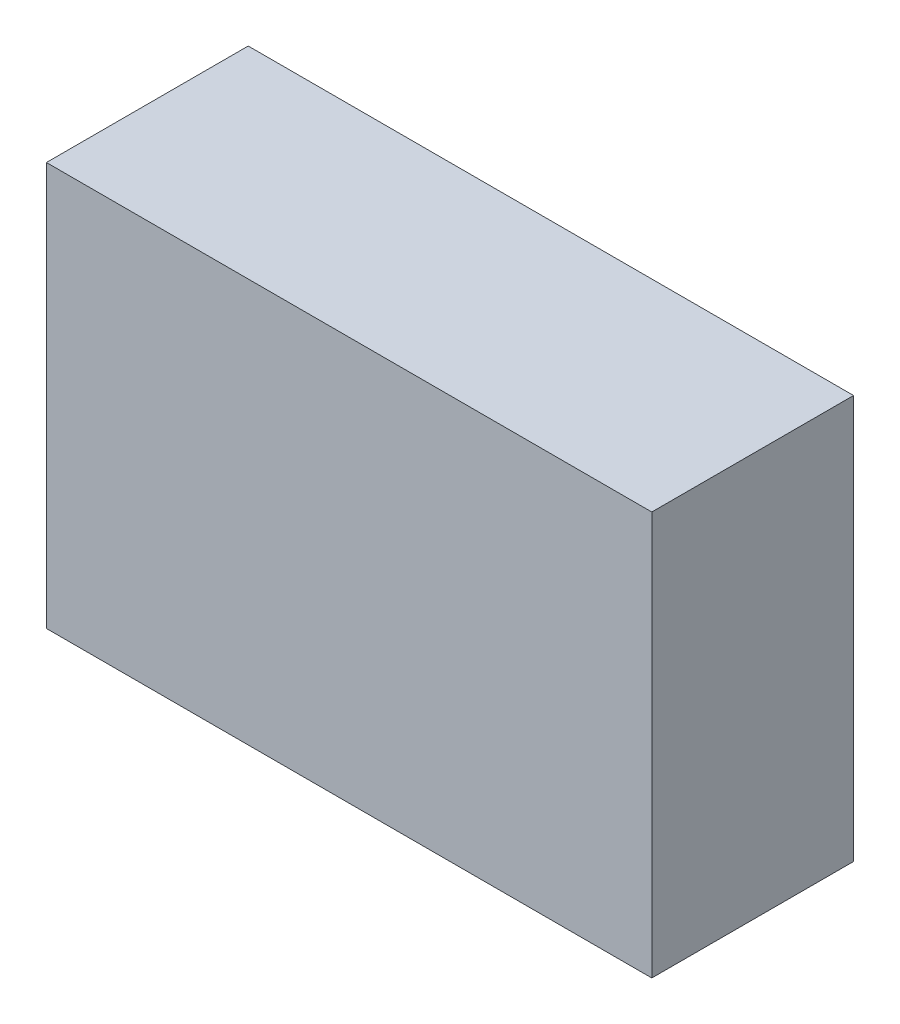
ISO-10303-21;
HEADER;
FILE_DESCRIPTION(('STEP AP214'),'2;1');
FILE_NAME('part.step','',(''),(''),'','','');
FILE_SCHEMA(('AUTOMOTIVE_DESIGN { 1 0 10303 214 1 1 1 1 }'));
ENDSEC;
DATA;
#1=APPLICATION_CONTEXT('core data for automotive mechanical design processes');
#2=APPLICATION_PROTOCOL_DEFINITION('international standard','automotive_design',2000,#1);
#3=PRODUCT_CONTEXT('',#1,'mechanical');
#4=PRODUCT('Part','Part','',(#3));
#5=PRODUCT_RELATED_PRODUCT_CATEGORY('part','',(#4));
#6=PRODUCT_DEFINITION_FORMATION('','',#4);
#7=PRODUCT_DEFINITION_CONTEXT('part definition',#1,'design');
#8=PRODUCT_DEFINITION('design','',#6,#7);
#9=PRODUCT_DEFINITION_SHAPE('','',#8);
#10=(LENGTH_UNIT() NAMED_UNIT(*) SI_UNIT(.MILLI.,.METRE.));
#11=(NAMED_UNIT(*) PLANE_ANGLE_UNIT() SI_UNIT($,.RADIAN.));
#12=(NAMED_UNIT(*) SI_UNIT($,.STERADIAN.) SOLID_ANGLE_UNIT());
#13=UNCERTAINTY_MEASURE_WITH_UNIT(LENGTH_MEASURE(1.E-05),#10,'distance_accuracy_value','');
#14=(GEOMETRIC_REPRESENTATION_CONTEXT(3) GLOBAL_UNCERTAINTY_ASSIGNED_CONTEXT((#13)) GLOBAL_UNIT_ASSIGNED_CONTEXT((#10,
#11,#12)) REPRESENTATION_CONTEXT('',''));
#15=CARTESIAN_POINT('',(0.,0.,0.));
#16=DIRECTION('',(0.,0.,1.));
#17=DIRECTION('',(1.,0.,0.));
#18=AXIS2_PLACEMENT_3D('',#15,#16,#17);
#19=CARTESIAN_POINT('',(7.5,-5.,-5.));
#20=DIRECTION('',(1.,0.,0.));
#21=DIRECTION('',(0.,0.,-1.));
#22=AXIS2_PLACEMENT_3D('',#19,#20,#21);
#23=PLANE('',#22);
#24=DIRECTION('',(0.,1.,0.));
#25=VECTOR('',#24,1.);
#26=CARTESIAN_POINT('',(7.5,-5.,0.));
#27=LINE('',#26,#25);
#28=CARTESIAN_POINT('',(7.5,-5.,0.));
#29=VERTEX_POINT('',#28);
#30=CARTESIAN_POINT('',(7.5,5.,0.));
#31=VERTEX_POINT('',#30);
#32=EDGE_CURVE('E104',#29,#31,#27,.T.);
#33=ORIENTED_EDGE('',*,*,#32,.F.);
#34=DIRECTION('',(0.,0.,1.));
#35=VECTOR('',#34,1.);
#36=CARTESIAN_POINT('',(7.5,-5.,-5.));
#37=LINE('',#36,#35);
#38=CARTESIAN_POINT('',(7.5,-5.,-5.));
#39=VERTEX_POINT('',#38);
#40=EDGE_CURVE('E11',#39,#29,#37,.T.);
#41=ORIENTED_EDGE('',*,*,#40,.F.);
#42=DIRECTION('',(0.,1.,0.));
#43=VECTOR('',#42,1.);
#44=CARTESIAN_POINT('',(7.5,-5.,-5.));
#45=LINE('',#44,#43);
#46=CARTESIAN_POINT('',(7.5,5.,-5.));
#47=VERTEX_POINT('',#46);
#48=EDGE_CURVE('E100',#39,#47,#45,.T.);
#49=ORIENTED_EDGE('',*,*,#48,.T.);
#50=DIRECTION('',(0.,0.,1.));
#51=VECTOR('',#50,1.);
#52=CARTESIAN_POINT('',(7.5,5.,-5.));
#53=LINE('',#52,#51);
#54=EDGE_CURVE('E45',#47,#31,#53,.T.);
#55=ORIENTED_EDGE('',*,*,#54,.T.);
#56=EDGE_LOOP('',(#33,#41,#49,#55));
#57=FACE_BOUND('',#56,.T.);
#58=ADVANCED_FACE('F39',(#57),#23,.T.);
#59=CARTESIAN_POINT('',(-7.5,-5.,-5.));
#60=DIRECTION('',(0.,-1.,0.));
#61=DIRECTION('',(0.,0.,-1.));
#62=AXIS2_PLACEMENT_3D('',#59,#60,#61);
#63=PLANE('',#62);
#64=DIRECTION('',(1.,0.,0.));
#65=VECTOR('',#64,1.);
#66=CARTESIAN_POINT('',(-7.5,-5.,0.));
#67=LINE('',#66,#65);
#68=CARTESIAN_POINT('',(-7.5,-5.,0.));
#69=VERTEX_POINT('',#68);
#70=EDGE_CURVE('E98',#69,#29,#67,.T.);
#71=ORIENTED_EDGE('',*,*,#70,.F.);
#72=DIRECTION('',(0.,0.,1.));
#73=VECTOR('',#72,1.);
#74=CARTESIAN_POINT('',(-7.5,-5.,-5.));
#75=LINE('',#74,#73);
#76=CARTESIAN_POINT('',(-7.5,-5.,-5.));
#77=VERTEX_POINT('',#76);
#78=EDGE_CURVE('E48',#77,#69,#75,.T.);
#79=ORIENTED_EDGE('',*,*,#78,.F.);
#80=DIRECTION('',(1.,0.,0.));
#81=VECTOR('',#80,1.);
#82=CARTESIAN_POINT('',(-7.5,-5.,-5.));
#83=LINE('',#82,#81);
#84=EDGE_CURVE('E92',#77,#39,#83,.T.);
#85=ORIENTED_EDGE('',*,*,#84,.T.);
#86=ORIENTED_EDGE('',*,*,#40,.T.);
#87=EDGE_LOOP('',(#71,#79,#85,#86));
#88=FACE_BOUND('',#87,.T.);
#89=ADVANCED_FACE('F111',(#88),#63,.T.);
#90=CARTESIAN_POINT('',(-7.5,-5.,-5.));
#91=DIRECTION('',(-1.,0.,0.));
#92=DIRECTION('',(0.,0.,1.));
#93=AXIS2_PLACEMENT_3D('',#90,#91,#92);
#94=PLANE('',#93);
#95=DIRECTION('',(0.,-1.,0.));
#96=VECTOR('',#95,1.);
#97=CARTESIAN_POINT('',(-7.5,-5.,0.));
#98=LINE('',#97,#96);
#99=CARTESIAN_POINT('',(-7.5,5.,0.));
#100=VERTEX_POINT('',#99);
#101=EDGE_CURVE('E87',#100,#69,#98,.T.);
#102=ORIENTED_EDGE('',*,*,#101,.F.);
#103=DIRECTION('',(0.,0.,1.));
#104=VECTOR('',#103,1.);
#105=CARTESIAN_POINT('',(-7.5,5.,-5.));
#106=LINE('',#105,#104);
#107=CARTESIAN_POINT('',(-7.5,5.,-5.));
#108=VERTEX_POINT('',#107);
#109=EDGE_CURVE('E84',#108,#100,#106,.T.);
#110=ORIENTED_EDGE('',*,*,#109,.F.);
#111=DIRECTION('',(0.,-1.,0.));
#112=VECTOR('',#111,1.);
#113=CARTESIAN_POINT('',(-7.5,-5.,-5.));
#114=LINE('',#113,#112);
#115=EDGE_CURVE('E90',#108,#77,#114,.T.);
#116=ORIENTED_EDGE('',*,*,#115,.T.);
#117=ORIENTED_EDGE('',*,*,#78,.T.);
#118=EDGE_LOOP('',(#102,#110,#116,#117));
#119=FACE_BOUND('',#118,.T.);
#120=ADVANCED_FACE('F86',(#119),#94,.T.);
#121=CARTESIAN_POINT('',(-7.5,5.,-5.));
#122=DIRECTION('',(0.,1.,0.));
#123=DIRECTION('',(0.,0.,1.));
#124=AXIS2_PLACEMENT_3D('',#121,#122,#123);
#125=PLANE('',#124);
#126=DIRECTION('',(-1.,0.,0.));
#127=VECTOR('',#126,1.);
#128=CARTESIAN_POINT('',(-7.5,5.,0.));
#129=LINE('',#128,#127);
#130=EDGE_CURVE('E107',#31,#100,#129,.T.);
#131=ORIENTED_EDGE('',*,*,#130,.F.);
#132=ORIENTED_EDGE('',*,*,#54,.F.);
#133=DIRECTION('',(-1.,0.,0.));
#134=VECTOR('',#133,1.);
#135=CARTESIAN_POINT('',(-7.5,5.,-5.));
#136=LINE('',#135,#134);
#137=EDGE_CURVE('E93',#47,#108,#136,.T.);
#138=ORIENTED_EDGE('',*,*,#137,.T.);
#139=ORIENTED_EDGE('',*,*,#109,.T.);
#140=EDGE_LOOP('',(#131,#132,#138,#139));
#141=FACE_BOUND('',#140,.T.);
#142=ADVANCED_FACE('F96',(#141),#125,.T.);
#143=CARTESIAN_POINT('',(0.,0.,-5.));
#144=DIRECTION('',(0.,0.,-1.));
#145=DIRECTION('',(-1.,0.,0.));
#146=AXIS2_PLACEMENT_3D('',#143,#144,#145);
#147=PLANE('',#146);
#148=ORIENTED_EDGE('',*,*,#48,.F.);
#149=ORIENTED_EDGE('',*,*,#84,.F.);
#150=ORIENTED_EDGE('',*,*,#115,.F.);
#151=ORIENTED_EDGE('',*,*,#137,.F.);
#152=EDGE_LOOP('',(#148,#149,#150,#151));
#153=FACE_BOUND('',#152,.T.);
#154=ADVANCED_FACE('F95',(#153),#147,.T.);
#155=CARTESIAN_POINT('',(0.,0.,0.));
#156=DIRECTION('',(0.,0.,-1.));
#157=DIRECTION('',(-1.,0.,0.));
#158=AXIS2_PLACEMENT_3D('',#155,#156,#157);
#159=PLANE('',#158);
#160=ORIENTED_EDGE('',*,*,#32,.T.);
#161=ORIENTED_EDGE('',*,*,#130,.T.);
#162=ORIENTED_EDGE('',*,*,#101,.T.);
#163=ORIENTED_EDGE('',*,*,#70,.T.);
#164=EDGE_LOOP('',(#160,#161,#162,#163));
#165=FACE_BOUND('',#164,.T.);
#166=ADVANCED_FACE('F115',(#165),#159,.F.);
#167=CLOSED_SHELL('',(#58,#89,#120,#142,#154,#166));
#168=MANIFOLD_SOLID_BREP('B2',#167);
#169=ADVANCED_BREP_SHAPE_REPRESENTATION('',(#18,#168),#14);
#170=SHAPE_DEFINITION_REPRESENTATION(#9,#169);
ENDSEC;
END-ISO-10303-21;
